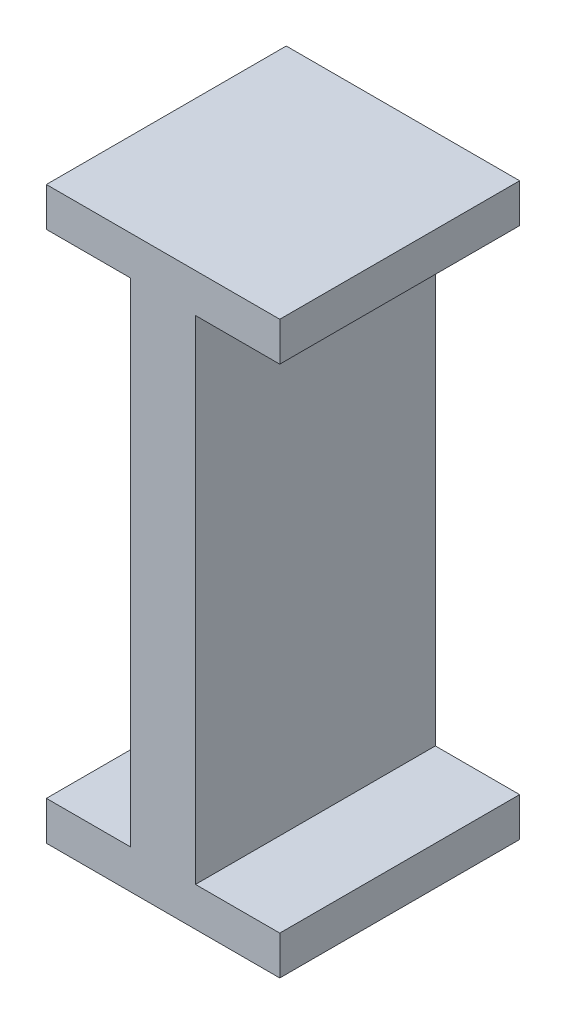
ISO-10303-21;
HEADER;
FILE_DESCRIPTION(('STEP AP214'),'2;1');
FILE_NAME('part.step','',(''),(''),'','','');
FILE_SCHEMA(('AUTOMOTIVE_DESIGN { 1 0 10303 214 1 1 1 1 }'));
ENDSEC;
DATA;
#1=APPLICATION_CONTEXT('core data for automotive mechanical design processes');
#2=APPLICATION_PROTOCOL_DEFINITION('international standard','automotive_design',2000,#1);
#3=PRODUCT_CONTEXT('',#1,'mechanical');
#4=PRODUCT('Part','Part','',(#3));
#5=PRODUCT_RELATED_PRODUCT_CATEGORY('part','',(#4));
#6=PRODUCT_DEFINITION_FORMATION('','',#4);
#7=PRODUCT_DEFINITION_CONTEXT('part definition',#1,'design');
#8=PRODUCT_DEFINITION('design','',#6,#7);
#9=PRODUCT_DEFINITION_SHAPE('','',#8);
#10=(LENGTH_UNIT() NAMED_UNIT(*) SI_UNIT(.MILLI.,.METRE.));
#11=(NAMED_UNIT(*) PLANE_ANGLE_UNIT() SI_UNIT($,.RADIAN.));
#12=(NAMED_UNIT(*) SI_UNIT($,.STERADIAN.) SOLID_ANGLE_UNIT());
#13=UNCERTAINTY_MEASURE_WITH_UNIT(LENGTH_MEASURE(1.E-05),#10,'distance_accuracy_value','');
#14=(GEOMETRIC_REPRESENTATION_CONTEXT(3) GLOBAL_UNCERTAINTY_ASSIGNED_CONTEXT((#13)) GLOBAL_UNIT_ASSIGNED_CONTEXT((#10,
#11,#12)) REPRESENTATION_CONTEXT('',''));
#15=CARTESIAN_POINT('',(0.,0.,0.));
#16=DIRECTION('',(0.,0.,1.));
#17=DIRECTION('',(1.,0.,0.));
#18=AXIS2_PLACEMENT_3D('',#15,#16,#17);
#19=CARTESIAN_POINT('',(0.,6.,0.));
#20=DIRECTION('',(0.,-1.,0.));
#21=DIRECTION('',(0.,0.,-1.));
#22=AXIS2_PLACEMENT_3D('',#19,#20,#21);
#23=PLANE('',#22);
#24=DIRECTION('',(0.,0.,1.));
#25=VECTOR('',#24,1.);
#26=CARTESIAN_POINT('',(-5.,6.,-18.5));
#27=LINE('',#26,#25);
#28=CARTESIAN_POINT('',(-5.,6.,-18.5));
#29=VERTEX_POINT('',#28);
#30=CARTESIAN_POINT('',(-5.,6.,18.5));
#31=VERTEX_POINT('',#30);
#32=EDGE_CURVE('E152',#29,#31,#27,.T.);
#33=ORIENTED_EDGE('',*,*,#32,.F.);
#34=DIRECTION('',(-1.,0.,0.));
#35=VECTOR('',#34,1.);
#36=CARTESIAN_POINT('',(-18.,6.,-18.5));
#37=LINE('',#36,#35);
#38=CARTESIAN_POINT('',(-18.,6.,-18.5));
#39=VERTEX_POINT('',#38);
#40=EDGE_CURVE('E247',#29,#39,#37,.T.);
#41=ORIENTED_EDGE('',*,*,#40,.T.);
#42=DIRECTION('',(0.,0.,1.));
#43=VECTOR('',#42,1.);
#44=CARTESIAN_POINT('',(-18.,6.,18.5));
#45=LINE('',#44,#43);
#46=CARTESIAN_POINT('',(-18.,6.,18.5));
#47=VERTEX_POINT('',#46);
#48=EDGE_CURVE('E222',#39,#47,#45,.T.);
#49=ORIENTED_EDGE('',*,*,#48,.T.);
#50=DIRECTION('',(1.,0.,0.));
#51=VECTOR('',#50,1.);
#52=CARTESIAN_POINT('',(-18.,6.,18.5));
#53=LINE('',#52,#51);
#54=EDGE_CURVE('E60',#47,#31,#53,.T.);
#55=ORIENTED_EDGE('',*,*,#54,.T.);
#56=EDGE_LOOP('',(#33,#41,#49,#55));
#57=FACE_BOUND('',#56,.T.);
#58=ADVANCED_FACE('F34',(#57),#23,.F.);
#59=DIRECTION('',(0.,0.,-1.));
#60=VECTOR('',#59,1.);
#61=CARTESIAN_POINT('',(5.,6.,-18.5));
#62=LINE('',#61,#60);
#63=CARTESIAN_POINT('',(5.,6.,18.5));
#64=VERTEX_POINT('',#63);
#65=CARTESIAN_POINT('',(5.,6.,-18.5));
#66=VERTEX_POINT('',#65);
#67=EDGE_CURVE('E52',#64,#66,#62,.T.);
#68=ORIENTED_EDGE('',*,*,#67,.F.);
#69=CARTESIAN_POINT('',(18.,6.,18.5));
#70=VERTEX_POINT('',#69);
#71=EDGE_CURVE('E219',#64,#70,#53,.T.);
#72=ORIENTED_EDGE('',*,*,#71,.T.);
#73=DIRECTION('',(0.,0.,-1.));
#74=VECTOR('',#73,1.);
#75=CARTESIAN_POINT('',(18.,6.,18.5));
#76=LINE('',#75,#74);
#77=CARTESIAN_POINT('',(18.,6.,-18.5));
#78=VERTEX_POINT('',#77);
#79=EDGE_CURVE('E237',#70,#78,#76,.T.);
#80=ORIENTED_EDGE('',*,*,#79,.T.);
#81=EDGE_CURVE('E246',#78,#66,#37,.T.);
#82=ORIENTED_EDGE('',*,*,#81,.T.);
#83=EDGE_LOOP('',(#68,#72,#80,#82));
#84=FACE_BOUND('',#83,.T.);
#85=ADVANCED_FACE('F284',(#84),#23,.F.);
#86=CARTESIAN_POINT('',(18.,6.,18.5));
#87=DIRECTION('',(-1.,0.,0.));
#88=DIRECTION('',(0.,0.,1.));
#89=AXIS2_PLACEMENT_3D('',#86,#87,#88);
#90=PLANE('',#89);
#91=DIRECTION('',(0.,0.,-1.));
#92=VECTOR('',#91,1.);
#93=CARTESIAN_POINT('',(18.,0.,18.5));
#94=LINE('',#93,#92);
#95=CARTESIAN_POINT('',(18.,0.,18.5));
#96=VERTEX_POINT('',#95);
#97=CARTESIAN_POINT('',(18.,0.,-18.5));
#98=VERTEX_POINT('',#97);
#99=EDGE_CURVE('E210',#96,#98,#94,.T.);
#100=ORIENTED_EDGE('',*,*,#99,.T.);
#101=DIRECTION('',(0.,-1.,0.));
#102=VECTOR('',#101,1.);
#103=CARTESIAN_POINT('',(18.,6.,-18.5));
#104=LINE('',#103,#102);
#105=EDGE_CURVE('E11',#78,#98,#104,.T.);
#106=ORIENTED_EDGE('',*,*,#105,.F.);
#107=ORIENTED_EDGE('',*,*,#79,.F.);
#108=DIRECTION('',(0.,-1.,0.));
#109=VECTOR('',#108,1.);
#110=CARTESIAN_POINT('',(18.,6.,18.5));
#111=LINE('',#110,#109);
#112=EDGE_CURVE('E238',#70,#96,#111,.T.);
#113=ORIENTED_EDGE('',*,*,#112,.T.);
#114=EDGE_LOOP('',(#100,#106,#107,#113));
#115=FACE_BOUND('',#114,.T.);
#116=ADVANCED_FACE('F36',(#115),#90,.F.);
#117=CARTESIAN_POINT('',(-18.,6.,-18.5));
#118=DIRECTION('',(0.,0.,1.));
#119=DIRECTION('',(1.,0.,0.));
#120=AXIS2_PLACEMENT_3D('',#117,#118,#119);
#121=PLANE('',#120);
#122=DIRECTION('',(-1.,0.,0.));
#123=VECTOR('',#122,1.);
#124=CARTESIAN_POINT('',(-18.,0.,-18.5));
#125=LINE('',#124,#123);
#126=CARTESIAN_POINT('',(-18.,0.,-18.5));
#127=VERTEX_POINT('',#126);
#128=EDGE_CURVE('E231',#98,#127,#125,.T.);
#129=ORIENTED_EDGE('',*,*,#128,.T.);
#130=DIRECTION('',(0.,-1.,0.));
#131=VECTOR('',#130,1.);
#132=CARTESIAN_POINT('',(-18.,6.,-18.5));
#133=LINE('',#132,#131);
#134=EDGE_CURVE('E44',#39,#127,#133,.T.);
#135=ORIENTED_EDGE('',*,*,#134,.F.);
#136=ORIENTED_EDGE('',*,*,#40,.F.);
#137=DIRECTION('',(0.,-1.,0.));
#138=VECTOR('',#137,1.);
#139=CARTESIAN_POINT('',(-5.,82.,-18.5));
#140=LINE('',#139,#138);
#141=CARTESIAN_POINT('',(-5.,82.,-18.5));
#142=VERTEX_POINT('',#141);
#143=EDGE_CURVE('E189',#142,#29,#140,.T.);
#144=ORIENTED_EDGE('',*,*,#143,.F.);
#145=DIRECTION('',(-1.,0.,0.));
#146=VECTOR('',#145,1.);
#147=CARTESIAN_POINT('',(-18.,82.,-18.5));
#148=LINE('',#147,#146);
#149=CARTESIAN_POINT('',(-18.,82.,-18.5));
#150=VERTEX_POINT('',#149);
#151=EDGE_CURVE('E163',#142,#150,#148,.T.);
#152=ORIENTED_EDGE('',*,*,#151,.T.);
#153=DIRECTION('',(0.,-1.,0.));
#154=VECTOR('',#153,1.);
#155=CARTESIAN_POINT('',(-18.,88.,-18.5));
#156=LINE('',#155,#154);
#157=CARTESIAN_POINT('',(-18.,88.,-18.5));
#158=VERTEX_POINT('',#157);
#159=EDGE_CURVE('E170',#158,#150,#156,.T.);
#160=ORIENTED_EDGE('',*,*,#159,.F.);
#161=DIRECTION('',(-1.,0.,0.));
#162=VECTOR('',#161,1.);
#163=CARTESIAN_POINT('',(-18.,88.,-18.5));
#164=LINE('',#163,#162);
#165=CARTESIAN_POINT('',(18.,88.,-18.5));
#166=VERTEX_POINT('',#165);
#167=EDGE_CURVE('E143',#166,#158,#164,.T.);
#168=ORIENTED_EDGE('',*,*,#167,.F.);
#169=DIRECTION('',(0.,-1.,0.));
#170=VECTOR('',#169,1.);
#171=CARTESIAN_POINT('',(18.,88.,-18.5));
#172=LINE('',#171,#170);
#173=CARTESIAN_POINT('',(18.,82.,-18.5));
#174=VERTEX_POINT('',#173);
#175=EDGE_CURVE('E156',#166,#174,#172,.T.);
#176=ORIENTED_EDGE('',*,*,#175,.T.);
#177=CARTESIAN_POINT('',(5.,82.,-18.5));
#178=VERTEX_POINT('',#177);
#179=EDGE_CURVE('E147',#174,#178,#148,.T.);
#180=ORIENTED_EDGE('',*,*,#179,.T.);
#181=DIRECTION('',(0.,-1.,0.));
#182=VECTOR('',#181,1.);
#183=CARTESIAN_POINT('',(5.,82.,-18.5));
#184=LINE('',#183,#182);
#185=EDGE_CURVE('E191',#178,#66,#184,.T.);
#186=ORIENTED_EDGE('',*,*,#185,.T.);
#187=ORIENTED_EDGE('',*,*,#81,.F.);
#188=ORIENTED_EDGE('',*,*,#105,.T.);
#189=EDGE_LOOP('',(#129,#135,#136,#144,#152,#160,#168,#176,#180,#186,#187,#188));
#190=FACE_BOUND('',#189,.T.);
#191=ADVANCED_FACE('F176',(#190),#121,.F.);
#192=CARTESIAN_POINT('',(-18.,6.,18.5));
#193=DIRECTION('',(1.,0.,0.));
#194=DIRECTION('',(0.,0.,-1.));
#195=AXIS2_PLACEMENT_3D('',#192,#193,#194);
#196=PLANE('',#195);
#197=DIRECTION('',(0.,0.,1.));
#198=VECTOR('',#197,1.);
#199=CARTESIAN_POINT('',(-18.,0.,18.5));
#200=LINE('',#199,#198);
#201=CARTESIAN_POINT('',(-18.,0.,18.5));
#202=VERTEX_POINT('',#201);
#203=EDGE_CURVE('E233',#127,#202,#200,.T.);
#204=ORIENTED_EDGE('',*,*,#203,.T.);
#205=DIRECTION('',(0.,-1.,0.));
#206=VECTOR('',#205,1.);
#207=CARTESIAN_POINT('',(-18.,6.,18.5));
#208=LINE('',#207,#206);
#209=EDGE_CURVE('E241',#47,#202,#208,.T.);
#210=ORIENTED_EDGE('',*,*,#209,.F.);
#211=ORIENTED_EDGE('',*,*,#48,.F.);
#212=ORIENTED_EDGE('',*,*,#134,.T.);
#213=EDGE_LOOP('',(#204,#210,#211,#212));
#214=FACE_BOUND('',#213,.T.);
#215=ADVANCED_FACE('F259',(#214),#196,.F.);
#216=CARTESIAN_POINT('',(-18.,6.,18.5));
#217=DIRECTION('',(0.,0.,-1.));
#218=DIRECTION('',(-1.,0.,0.));
#219=AXIS2_PLACEMENT_3D('',#216,#217,#218);
#220=PLANE('',#219);
#221=DIRECTION('',(1.,0.,0.));
#222=VECTOR('',#221,1.);
#223=CARTESIAN_POINT('',(-18.,0.,18.5));
#224=LINE('',#223,#222);
#225=EDGE_CURVE('E235',#202,#96,#224,.T.);
#226=ORIENTED_EDGE('',*,*,#225,.T.);
#227=ORIENTED_EDGE('',*,*,#112,.F.);
#228=ORIENTED_EDGE('',*,*,#71,.F.);
#229=DIRECTION('',(0.,-1.,0.));
#230=VECTOR('',#229,1.);
#231=CARTESIAN_POINT('',(5.,82.,18.5));
#232=LINE('',#231,#230);
#233=CARTESIAN_POINT('',(5.,82.,18.5));
#234=VERTEX_POINT('',#233);
#235=EDGE_CURVE('E211',#234,#64,#232,.T.);
#236=ORIENTED_EDGE('',*,*,#235,.F.);
#237=DIRECTION('',(1.,0.,0.));
#238=VECTOR('',#237,1.);
#239=CARTESIAN_POINT('',(-18.,82.,18.5));
#240=LINE('',#239,#238);
#241=CARTESIAN_POINT('',(18.,82.,18.5));
#242=VERTEX_POINT('',#241);
#243=EDGE_CURVE('E186',#234,#242,#240,.T.);
#244=ORIENTED_EDGE('',*,*,#243,.T.);
#245=DIRECTION('',(0.,-1.,0.));
#246=VECTOR('',#245,1.);
#247=CARTESIAN_POINT('',(18.,88.,18.5));
#248=LINE('',#247,#246);
#249=CARTESIAN_POINT('',(18.,88.,18.5));
#250=VERTEX_POINT('',#249);
#251=EDGE_CURVE('E134',#250,#242,#248,.T.);
#252=ORIENTED_EDGE('',*,*,#251,.F.);
#253=DIRECTION('',(1.,0.,0.));
#254=VECTOR('',#253,1.);
#255=CARTESIAN_POINT('',(-18.,88.,18.5));
#256=LINE('',#255,#254);
#257=CARTESIAN_POINT('',(-18.,88.,18.5));
#258=VERTEX_POINT('',#257);
#259=EDGE_CURVE('E126',#258,#250,#256,.T.);
#260=ORIENTED_EDGE('',*,*,#259,.F.);
#261=DIRECTION('',(0.,-1.,0.));
#262=VECTOR('',#261,1.);
#263=CARTESIAN_POINT('',(-18.,88.,18.5));
#264=LINE('',#263,#262);
#265=CARTESIAN_POINT('',(-18.,82.,18.5));
#266=VERTEX_POINT('',#265);
#267=EDGE_CURVE('E131',#258,#266,#264,.T.);
#268=ORIENTED_EDGE('',*,*,#267,.T.);
#269=CARTESIAN_POINT('',(-5.,82.,18.5));
#270=VERTEX_POINT('',#269);
#271=EDGE_CURVE('E261',#266,#270,#240,.T.);
#272=ORIENTED_EDGE('',*,*,#271,.T.);
#273=DIRECTION('',(0.,-1.,0.));
#274=VECTOR('',#273,1.);
#275=CARTESIAN_POINT('',(-5.,82.,18.5));
#276=LINE('',#275,#274);
#277=EDGE_CURVE('E208',#270,#31,#276,.T.);
#278=ORIENTED_EDGE('',*,*,#277,.T.);
#279=ORIENTED_EDGE('',*,*,#54,.F.);
#280=ORIENTED_EDGE('',*,*,#209,.T.);
#281=EDGE_LOOP('',(#226,#227,#228,#236,#244,#252,#260,#268,#272,#278,#279,#280));
#282=FACE_BOUND('',#281,.T.);
#283=ADVANCED_FACE('F128',(#282),#220,.F.);
#284=CARTESIAN_POINT('',(0.,0.,0.));
#285=DIRECTION('',(0.,-1.,0.));
#286=DIRECTION('',(0.,0.,-1.));
#287=AXIS2_PLACEMENT_3D('',#284,#285,#286);
#288=PLANE('',#287);
#289=ORIENTED_EDGE('',*,*,#99,.F.);
#290=ORIENTED_EDGE('',*,*,#225,.F.);
#291=ORIENTED_EDGE('',*,*,#203,.F.);
#292=ORIENTED_EDGE('',*,*,#128,.F.);
#293=EDGE_LOOP('',(#289,#290,#291,#292));
#294=FACE_BOUND('',#293,.T.);
#295=ADVANCED_FACE('F292',(#294),#288,.T.);
#296=CARTESIAN_POINT('',(-5.,82.,-18.5));
#297=DIRECTION('',(1.,0.,0.));
#298=DIRECTION('',(0.,0.,-1.));
#299=AXIS2_PLACEMENT_3D('',#296,#297,#298);
#300=PLANE('',#299);
#301=ORIENTED_EDGE('',*,*,#32,.T.);
#302=ORIENTED_EDGE('',*,*,#277,.F.);
#303=DIRECTION('',(0.,0.,1.));
#304=VECTOR('',#303,1.);
#305=CARTESIAN_POINT('',(-5.,82.,-18.5));
#306=LINE('',#305,#304);
#307=EDGE_CURVE('E38',#142,#270,#306,.T.);
#308=ORIENTED_EDGE('',*,*,#307,.F.);
#309=ORIENTED_EDGE('',*,*,#143,.T.);
#310=EDGE_LOOP('',(#301,#302,#308,#309));
#311=FACE_BOUND('',#310,.T.);
#312=ADVANCED_FACE('F264',(#311),#300,.F.);
#313=CARTESIAN_POINT('',(5.,82.,-18.5));
#314=DIRECTION('',(-1.,0.,0.));
#315=DIRECTION('',(0.,0.,1.));
#316=AXIS2_PLACEMENT_3D('',#313,#314,#315);
#317=PLANE('',#316);
#318=ORIENTED_EDGE('',*,*,#67,.T.);
#319=ORIENTED_EDGE('',*,*,#185,.F.);
#320=DIRECTION('',(0.,0.,-1.));
#321=VECTOR('',#320,1.);
#322=CARTESIAN_POINT('',(5.,82.,-18.5));
#323=LINE('',#322,#321);
#324=EDGE_CURVE('E185',#234,#178,#323,.T.);
#325=ORIENTED_EDGE('',*,*,#324,.F.);
#326=ORIENTED_EDGE('',*,*,#235,.T.);
#327=EDGE_LOOP('',(#318,#319,#325,#326));
#328=FACE_BOUND('',#327,.T.);
#329=ADVANCED_FACE('F308',(#328),#317,.F.);
#330=CARTESIAN_POINT('',(0.,82.,0.));
#331=DIRECTION('',(0.,1.,0.));
#332=DIRECTION('',(0.,0.,1.));
#333=AXIS2_PLACEMENT_3D('',#330,#331,#332);
#334=PLANE('',#333);
#335=ORIENTED_EDGE('',*,*,#151,.F.);
#336=ORIENTED_EDGE('',*,*,#307,.T.);
#337=ORIENTED_EDGE('',*,*,#271,.F.);
#338=DIRECTION('',(0.,0.,1.));
#339=VECTOR('',#338,1.);
#340=CARTESIAN_POINT('',(-18.,82.,-18.5));
#341=LINE('',#340,#339);
#342=EDGE_CURVE('E151',#150,#266,#341,.T.);
#343=ORIENTED_EDGE('',*,*,#342,.F.);
#344=EDGE_LOOP('',(#335,#336,#337,#343));
#345=FACE_BOUND('',#344,.T.);
#346=ADVANCED_FACE('F267',(#345),#334,.F.);
#347=ORIENTED_EDGE('',*,*,#243,.F.);
#348=ORIENTED_EDGE('',*,*,#324,.T.);
#349=ORIENTED_EDGE('',*,*,#179,.F.);
#350=DIRECTION('',(0.,0.,-1.));
#351=VECTOR('',#350,1.);
#352=CARTESIAN_POINT('',(18.,82.,-18.5));
#353=LINE('',#352,#351);
#354=EDGE_CURVE('E168',#242,#174,#353,.T.);
#355=ORIENTED_EDGE('',*,*,#354,.F.);
#356=EDGE_LOOP('',(#347,#348,#349,#355));
#357=FACE_BOUND('',#356,.T.);
#358=ADVANCED_FACE('F183',(#357),#334,.F.);
#359=CARTESIAN_POINT('',(-18.,88.,-18.5));
#360=DIRECTION('',(1.,0.,0.));
#361=DIRECTION('',(0.,0.,-1.));
#362=AXIS2_PLACEMENT_3D('',#359,#360,#361);
#363=PLANE('',#362);
#364=ORIENTED_EDGE('',*,*,#342,.T.);
#365=ORIENTED_EDGE('',*,*,#267,.F.);
#366=DIRECTION('',(0.,0.,1.));
#367=VECTOR('',#366,1.);
#368=CARTESIAN_POINT('',(-18.,88.,-18.5));
#369=LINE('',#368,#367);
#370=EDGE_CURVE('E138',#158,#258,#369,.T.);
#371=ORIENTED_EDGE('',*,*,#370,.F.);
#372=ORIENTED_EDGE('',*,*,#159,.T.);
#373=EDGE_LOOP('',(#364,#365,#371,#372));
#374=FACE_BOUND('',#373,.T.);
#375=ADVANCED_FACE('F149',(#374),#363,.F.);
#376=CARTESIAN_POINT('',(18.,88.,-18.5));
#377=DIRECTION('',(-1.,0.,0.));
#378=DIRECTION('',(0.,0.,1.));
#379=AXIS2_PLACEMENT_3D('',#376,#377,#378);
#380=PLANE('',#379);
#381=ORIENTED_EDGE('',*,*,#354,.T.);
#382=ORIENTED_EDGE('',*,*,#175,.F.);
#383=DIRECTION('',(0.,0.,-1.));
#384=VECTOR('',#383,1.);
#385=CARTESIAN_POINT('',(18.,88.,-18.5));
#386=LINE('',#385,#384);
#387=EDGE_CURVE('E137',#250,#166,#386,.T.);
#388=ORIENTED_EDGE('',*,*,#387,.F.);
#389=ORIENTED_EDGE('',*,*,#251,.T.);
#390=EDGE_LOOP('',(#381,#382,#388,#389));
#391=FACE_BOUND('',#390,.T.);
#392=ADVANCED_FACE('F273',(#391),#380,.F.);
#393=CARTESIAN_POINT('',(0.,88.,0.));
#394=DIRECTION('',(0.,1.,0.));
#395=DIRECTION('',(0.,0.,1.));
#396=AXIS2_PLACEMENT_3D('',#393,#394,#395);
#397=PLANE('',#396);
#398=ORIENTED_EDGE('',*,*,#370,.T.);
#399=ORIENTED_EDGE('',*,*,#259,.T.);
#400=ORIENTED_EDGE('',*,*,#387,.T.);
#401=ORIENTED_EDGE('',*,*,#167,.T.);
#402=EDGE_LOOP('',(#398,#399,#400,#401));
#403=FACE_BOUND('',#402,.T.);
#404=ADVANCED_FACE('F141',(#403),#397,.T.);
#405=CLOSED_SHELL('',(#58,#85,#116,#191,#215,#283,#295,#312,#329,#346,#358,#375,#392,#404));
#406=MANIFOLD_SOLID_BREP('B2',#405);
#407=ADVANCED_BREP_SHAPE_REPRESENTATION('',(#18,#406),#14);
#408=SHAPE_DEFINITION_REPRESENTATION(#9,#407);
ENDSEC;
END-ISO-10303-21;
